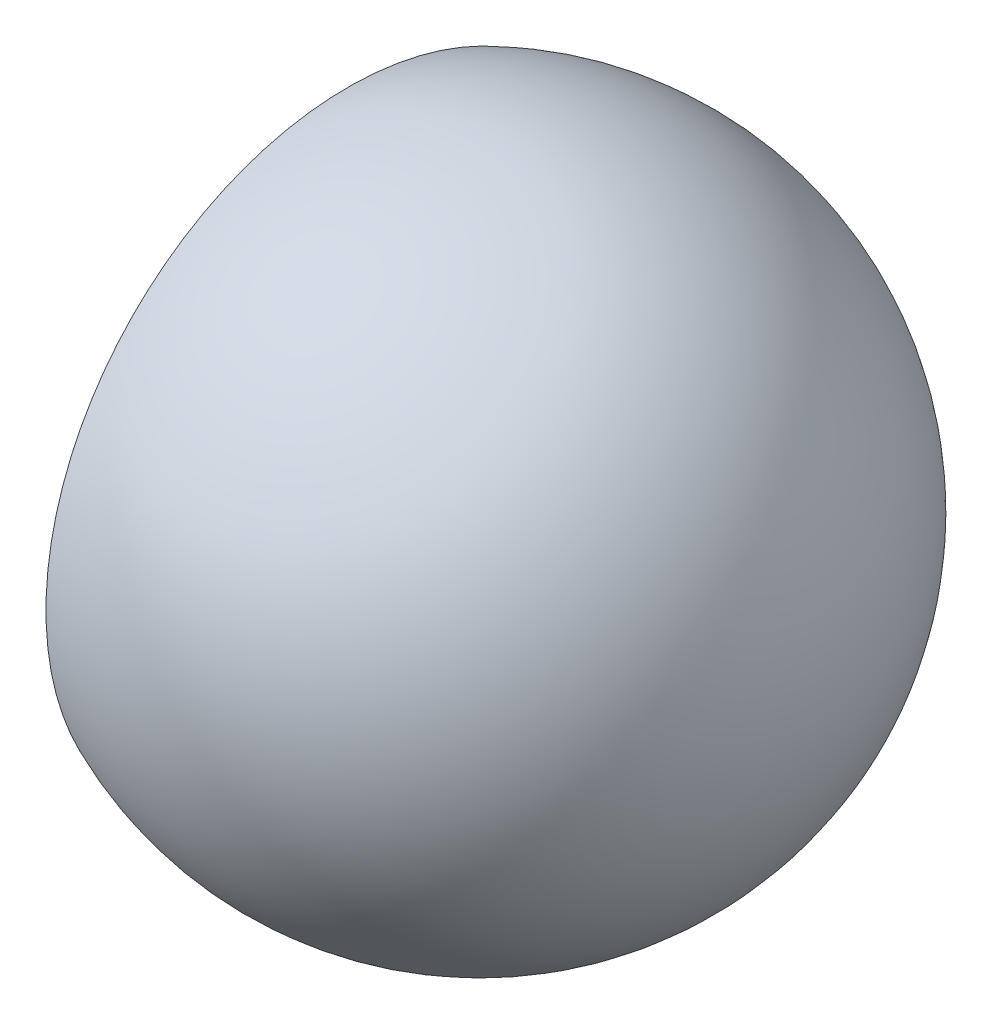
ISO-10303-21;
HEADER;
FILE_DESCRIPTION(('STEP AP214'),'2;1');
FILE_NAME('part.step','',(''),(''),'','','');
FILE_SCHEMA(('AUTOMOTIVE_DESIGN { 1 0 10303 214 1 1 1 1 }'));
ENDSEC;
DATA;
#1=APPLICATION_CONTEXT('core data for automotive mechanical design processes');
#2=APPLICATION_PROTOCOL_DEFINITION('international standard','automotive_design',2000,#1);
#3=PRODUCT_CONTEXT('',#1,'mechanical');
#4=PRODUCT('Part','Part','',(#3));
#5=PRODUCT_RELATED_PRODUCT_CATEGORY('part','',(#4));
#6=PRODUCT_DEFINITION_FORMATION('','',#4);
#7=PRODUCT_DEFINITION_CONTEXT('part definition',#1,'design');
#8=PRODUCT_DEFINITION('design','',#6,#7);
#9=PRODUCT_DEFINITION_SHAPE('','',#8);
#10=(LENGTH_UNIT() NAMED_UNIT(*) SI_UNIT(.MILLI.,.METRE.));
#11=(NAMED_UNIT(*) PLANE_ANGLE_UNIT() SI_UNIT($,.RADIAN.));
#12=(NAMED_UNIT(*) SI_UNIT($,.STERADIAN.) SOLID_ANGLE_UNIT());
#13=UNCERTAINTY_MEASURE_WITH_UNIT(LENGTH_MEASURE(1.E-05),#10,'distance_accuracy_value','');
#14=(GEOMETRIC_REPRESENTATION_CONTEXT(3) GLOBAL_UNCERTAINTY_ASSIGNED_CONTEXT((#13)) GLOBAL_UNIT_ASSIGNED_CONTEXT((#10,
#11,#12)) REPRESENTATION_CONTEXT('',''));
#15=CARTESIAN_POINT('',(0.,0.,0.));
#16=DIRECTION('',(0.,0.,1.));
#17=DIRECTION('',(1.,0.,0.));
#18=AXIS2_PLACEMENT_3D('',#15,#16,#17);
#19=CARTESIAN_POINT('',(133.518220958984,53.0562965811188,0.));
#20=DIRECTION('',(0.,1.,0.));
#21=DIRECTION('',(1.,0.,0.));
#22=AXIS2_PLACEMENT_3D('',#19,#20,#21);
#23=SPHERICAL_SURFACE('',#22,117.5);
#24=CARTESIAN_POINT('',(133.518220958984,53.0562965811188,0.));
#25=DIRECTION('',(1.,0.,0.));
#26=DIRECTION('',(0.,0.,-1.));
#27=AXIS2_PLACEMENT_3D('',#24,#25,#26);
#28=SPHERICAL_SURFACE('',#27,117.5);
#29=CARTESIAN_POINT('',(84.518220958984,53.0562965811188,0.));
#30=DIRECTION('',(1.,0.,0.));
#31=DIRECTION('',(0.,0.,-1.));
#32=AXIS2_PLACEMENT_3D('',#29,#30,#31);
#33=CIRCLE('',#32,106.795365067965);
#34=CARTESIAN_POINT('',(84.518220958984,53.0562965811188,-106.795365067965));
#35=VERTEX_POINT('',#34);
#36=EDGE_CURVE('E38',#35,#35,#33,.T.);
#37=ORIENTED_EDGE('',*,*,#36,.F.);
#38=EDGE_LOOP('',(#37));
#39=FACE_BOUND('',#38,.T.);
#40=ADVANCED_FACE('F34',(#39),#28,.F.);
#41=CARTESIAN_POINT('',(84.518220958984,53.0562965811188,0.));
#42=DIRECTION('',(1.,0.,0.));
#43=DIRECTION('',(0.,0.,-1.));
#44=AXIS2_PLACEMENT_3D('',#41,#42,#43);
#45=PLANE('',#44);
#46=CARTESIAN_POINT('',(84.518220958984,53.0562965811188,0.));
#47=DIRECTION('',(1.,0.,0.));
#48=DIRECTION('',(0.,0.,-1.));
#49=AXIS2_PLACEMENT_3D('',#46,#47,#48);
#50=CIRCLE('',#49,112.273104526418);
#51=CARTESIAN_POINT('',(84.518220958984,53.0562965811188,-112.273104526418));
#52=VERTEX_POINT('',#51);
#53=EDGE_CURVE('E10',#52,#52,#50,.F.);
#54=ORIENTED_EDGE('',*,*,#53,.T.);
#55=EDGE_LOOP('',(#54));
#56=FACE_BOUND('',#55,.T.);
#57=ORIENTED_EDGE('',*,*,#36,.T.);
#58=EDGE_LOOP('',(#57));
#59=FACE_BOUND('',#58,.T.);
#60=ADVANCED_FACE('F47',(#56,#59),#45,.F.);
#61=CARTESIAN_POINT('',(133.518220958984,53.0562965811188,0.));
#62=DIRECTION('',(0.,-1.,0.));
#63=DIRECTION('',(-1.,0.,0.));
#64=AXIS2_PLACEMENT_3D('',#61,#62,#63);
#65=SPHERICAL_SURFACE('',#64,122.5);
#66=CARTESIAN_POINT('',(133.518220958984,53.0562965811188,0.));
#67=DIRECTION('',(1.,0.,0.));
#68=DIRECTION('',(0.,0.,-1.));
#69=AXIS2_PLACEMENT_3D('',#66,#67,#68);
#70=SPHERICAL_SURFACE('',#69,122.5);
#71=ORIENTED_EDGE('',*,*,#53,.F.);
#72=EDGE_LOOP('',(#71));
#73=FACE_BOUND('',#72,.T.);
#74=ADVANCED_FACE('F36',(#73),#70,.T.);
#75=CLOSED_SHELL('',(#40,#60,#74));
#76=MANIFOLD_SOLID_BREP('B2',#75);
#77=ADVANCED_BREP_SHAPE_REPRESENTATION('',(#18,#76),#14);
#78=SHAPE_DEFINITION_REPRESENTATION(#9,#77);
ENDSEC;
END-ISO-10303-21;
